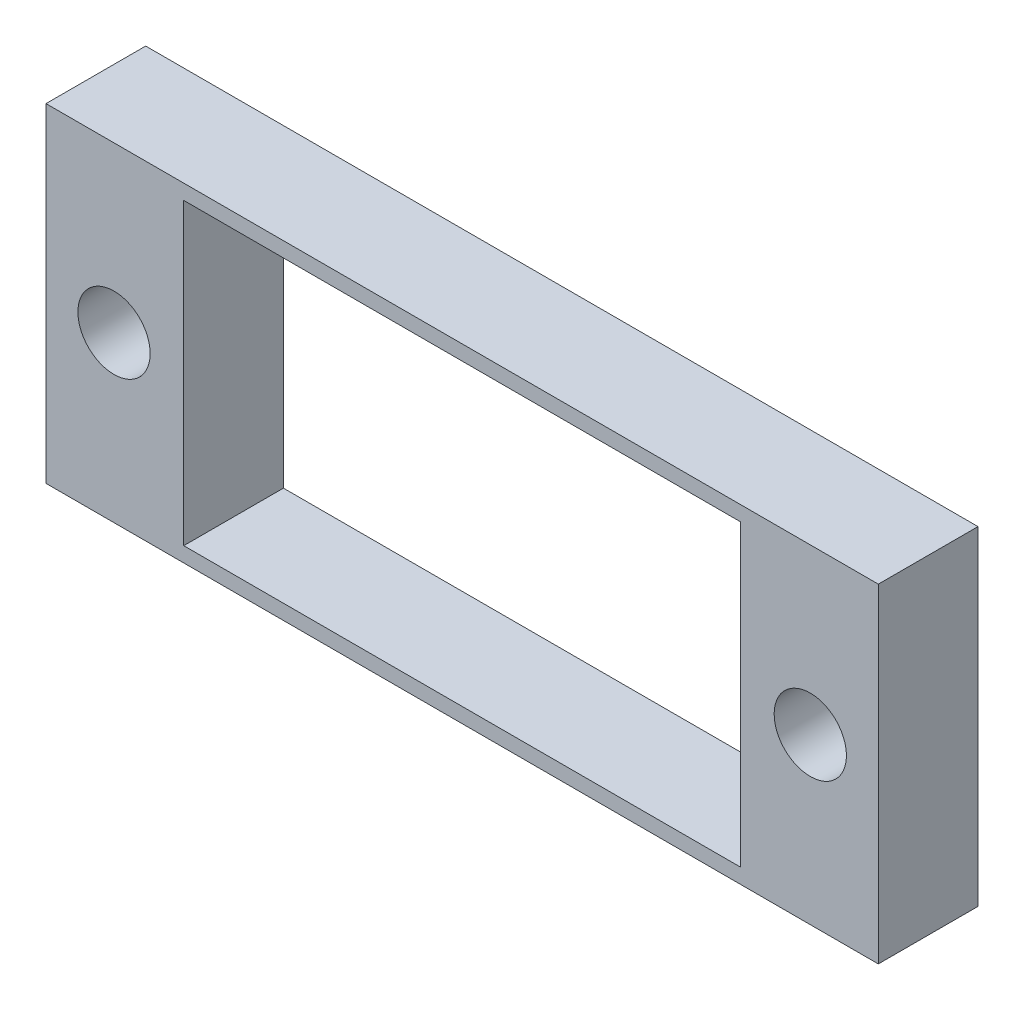
ISO-10303-21;
HEADER;
FILE_DESCRIPTION(('STEP AP214'),'2;1');
FILE_NAME('part.step','',(''),(''),'','','');
FILE_SCHEMA(('AUTOMOTIVE_DESIGN { 1 0 10303 214 1 1 1 1 }'));
ENDSEC;
DATA;
#1=APPLICATION_CONTEXT('core data for automotive mechanical design processes');
#2=APPLICATION_PROTOCOL_DEFINITION('international standard','automotive_design',2000,#1);
#3=PRODUCT_CONTEXT('',#1,'mechanical');
#4=PRODUCT('Part','Part','',(#3));
#5=PRODUCT_RELATED_PRODUCT_CATEGORY('part','',(#4));
#6=PRODUCT_DEFINITION_FORMATION('','',#4);
#7=PRODUCT_DEFINITION_CONTEXT('part definition',#1,'design');
#8=PRODUCT_DEFINITION('design','',#6,#7);
#9=PRODUCT_DEFINITION_SHAPE('','',#8);
#10=(LENGTH_UNIT() NAMED_UNIT(*) SI_UNIT(.MILLI.,.METRE.));
#11=(NAMED_UNIT(*) PLANE_ANGLE_UNIT() SI_UNIT($,.RADIAN.));
#12=(NAMED_UNIT(*) SI_UNIT($,.STERADIAN.) SOLID_ANGLE_UNIT());
#13=UNCERTAINTY_MEASURE_WITH_UNIT(LENGTH_MEASURE(1.E-05),#10,'distance_accuracy_value','');
#14=(GEOMETRIC_REPRESENTATION_CONTEXT(3) GLOBAL_UNCERTAINTY_ASSIGNED_CONTEXT((#13)) GLOBAL_UNIT_ASSIGNED_CONTEXT((#10,
#11,#12)) REPRESENTATION_CONTEXT('',''));
#15=CARTESIAN_POINT('',(0.,0.,0.));
#16=DIRECTION('',(0.,0.,1.));
#17=DIRECTION('',(1.,0.,0.));
#18=AXIS2_PLACEMENT_3D('',#15,#16,#17);
#19=CARTESIAN_POINT('',(0.,0.,4.));
#20=DIRECTION('',(0.,0.,-1.));
#21=DIRECTION('',(-1.,0.,0.));
#22=AXIS2_PLACEMENT_3D('',#19,#20,#21);
#23=PLANE('',#22);
#24=CARTESIAN_POINT('',(-13.97,0.,4.));
#25=DIRECTION('',(0.,0.,1.));
#26=DIRECTION('',(1.,0.,0.));
#27=AXIS2_PLACEMENT_3D('',#24,#25,#26);
#28=CIRCLE('',#27,1.45);
#29=CARTESIAN_POINT('',(-12.52,0.,4.));
#30=VERTEX_POINT('',#29);
#31=EDGE_CURVE('E223',#30,#30,#28,.T.);
#32=ORIENTED_EDGE('',*,*,#31,.F.);
#33=EDGE_LOOP('',(#32));
#34=FACE_BOUND('',#33,.T.);
#35=CARTESIAN_POINT('',(13.97,0.,4.));
#36=DIRECTION('',(0.,0.,1.));
#37=DIRECTION('',(-1.,0.,0.));
#38=AXIS2_PLACEMENT_3D('',#35,#36,#37);
#39=CIRCLE('',#38,1.45);
#40=CARTESIAN_POINT('',(12.52,0.,4.));
#41=VERTEX_POINT('',#40);
#42=EDGE_CURVE('E228',#41,#41,#39,.T.);
#43=ORIENTED_EDGE('',*,*,#42,.F.);
#44=EDGE_LOOP('',(#43));
#45=FACE_BOUND('',#44,.T.);
#46=DIRECTION('',(-1.,0.,0.));
#47=VECTOR('',#46,1.);
#48=CARTESIAN_POINT('',(-16.1,6.,4.));
#49=LINE('',#48,#47);
#50=CARTESIAN_POINT('',(11.1724,6.,4.));
#51=VERTEX_POINT('',#50);
#52=CARTESIAN_POINT('',(-11.1724,6.,4.));
#53=VERTEX_POINT('',#52);
#54=EDGE_CURVE('E106',#51,#53,#49,.T.);
#55=ORIENTED_EDGE('',*,*,#54,.F.);
#56=DIRECTION('',(0.,-1.,0.));
#57=VECTOR('',#56,1.);
#58=CARTESIAN_POINT('',(11.1724,6.,4.));
#59=LINE('',#58,#57);
#60=CARTESIAN_POINT('',(11.1724,-6.,4.));
#61=VERTEX_POINT('',#60);
#62=EDGE_CURVE('E102',#51,#61,#59,.T.);
#63=ORIENTED_EDGE('',*,*,#62,.T.);
#64=DIRECTION('',(1.,0.,0.));
#65=VECTOR('',#64,1.);
#66=CARTESIAN_POINT('',(-16.1,-6.,4.));
#67=LINE('',#66,#65);
#68=CARTESIAN_POINT('',(-11.1724,-6.,4.));
#69=VERTEX_POINT('',#68);
#70=EDGE_CURVE('E96',#69,#61,#67,.T.);
#71=ORIENTED_EDGE('',*,*,#70,.F.);
#72=DIRECTION('',(0.,1.,0.));
#73=VECTOR('',#72,1.);
#74=CARTESIAN_POINT('',(-11.1724,6.,4.));
#75=LINE('',#74,#73);
#76=EDGE_CURVE('E100',#69,#53,#75,.T.);
#77=ORIENTED_EDGE('',*,*,#76,.T.);
#78=EDGE_LOOP('',(#55,#63,#71,#77));
#79=FACE_BOUND('',#78,.T.);
#80=DIRECTION('',(0.,-1.,0.));
#81=VECTOR('',#80,1.);
#82=CARTESIAN_POINT('',(-16.7,-6.6,4.));
#83=LINE('',#82,#81);
#84=CARTESIAN_POINT('',(-16.7,6.6,4.));
#85=VERTEX_POINT('',#84);
#86=CARTESIAN_POINT('',(-16.7,-6.6,4.));
#87=VERTEX_POINT('',#86);
#88=EDGE_CURVE('E131',#85,#87,#83,.T.);
#89=ORIENTED_EDGE('',*,*,#88,.T.);
#90=DIRECTION('',(1.,0.,0.));
#91=VECTOR('',#90,1.);
#92=CARTESIAN_POINT('',(-16.7,-6.6,4.));
#93=LINE('',#92,#91);
#94=CARTESIAN_POINT('',(16.7,-6.6,4.));
#95=VERTEX_POINT('',#94);
#96=EDGE_CURVE('E134',#87,#95,#93,.T.);
#97=ORIENTED_EDGE('',*,*,#96,.T.);
#98=DIRECTION('',(0.,1.,0.));
#99=VECTOR('',#98,1.);
#100=CARTESIAN_POINT('',(16.7,-6.6,4.));
#101=LINE('',#100,#99);
#102=CARTESIAN_POINT('',(16.7,6.6,4.));
#103=VERTEX_POINT('',#102);
#104=EDGE_CURVE('E137',#95,#103,#101,.T.);
#105=ORIENTED_EDGE('',*,*,#104,.T.);
#106=DIRECTION('',(-1.,0.,0.));
#107=VECTOR('',#106,1.);
#108=CARTESIAN_POINT('',(-16.7,6.6,4.));
#109=LINE('',#108,#107);
#110=EDGE_CURVE('E139',#103,#85,#109,.T.);
#111=ORIENTED_EDGE('',*,*,#110,.T.);
#112=EDGE_LOOP('',(#89,#97,#105,#111));
#113=FACE_BOUND('',#112,.T.);
#114=ADVANCED_FACE('F33',(#34,#45,#79,#113),#23,.F.);
#115=CARTESIAN_POINT('',(0.,0.,0.));
#116=DIRECTION('',(0.,0.,-1.));
#117=DIRECTION('',(-1.,0.,0.));
#118=AXIS2_PLACEMENT_3D('',#115,#116,#117);
#119=PLANE('',#118);
#120=CARTESIAN_POINT('',(-13.97,0.,0.));
#121=DIRECTION('',(0.,0.,1.));
#122=DIRECTION('',(1.,0.,0.));
#123=AXIS2_PLACEMENT_3D('',#120,#121,#122);
#124=CIRCLE('',#123,1.45);
#125=CARTESIAN_POINT('',(-12.52,0.,0.));
#126=VERTEX_POINT('',#125);
#127=EDGE_CURVE('E221',#126,#126,#124,.T.);
#128=ORIENTED_EDGE('',*,*,#127,.T.);
#129=EDGE_LOOP('',(#128));
#130=FACE_BOUND('',#129,.T.);
#131=CARTESIAN_POINT('',(13.97,0.,0.));
#132=DIRECTION('',(0.,0.,1.));
#133=DIRECTION('',(-1.,0.,0.));
#134=AXIS2_PLACEMENT_3D('',#131,#132,#133);
#135=CIRCLE('',#134,1.45);
#136=CARTESIAN_POINT('',(12.52,0.,0.));
#137=VERTEX_POINT('',#136);
#138=EDGE_CURVE('E224',#137,#137,#135,.T.);
#139=ORIENTED_EDGE('',*,*,#138,.T.);
#140=EDGE_LOOP('',(#139));
#141=FACE_BOUND('',#140,.T.);
#142=DIRECTION('',(0.,-1.,0.));
#143=VECTOR('',#142,1.);
#144=CARTESIAN_POINT('',(11.1724,6.,0.));
#145=LINE('',#144,#143);
#146=CARTESIAN_POINT('',(11.1724,6.,0.));
#147=VERTEX_POINT('',#146);
#148=CARTESIAN_POINT('',(11.1724,-6.,0.));
#149=VERTEX_POINT('',#148);
#150=EDGE_CURVE('E233',#147,#149,#145,.T.);
#151=ORIENTED_EDGE('',*,*,#150,.F.);
#152=DIRECTION('',(-1.,0.,0.));
#153=VECTOR('',#152,1.);
#154=CARTESIAN_POINT('',(-16.1,6.,0.));
#155=LINE('',#154,#153);
#156=CARTESIAN_POINT('',(-11.1724,6.,0.));
#157=VERTEX_POINT('',#156);
#158=EDGE_CURVE('E53',#147,#157,#155,.T.);
#159=ORIENTED_EDGE('',*,*,#158,.T.);
#160=DIRECTION('',(0.,1.,0.));
#161=VECTOR('',#160,1.);
#162=CARTESIAN_POINT('',(-11.1724,6.,0.));
#163=LINE('',#162,#161);
#164=CARTESIAN_POINT('',(-11.1724,-6.,0.));
#165=VERTEX_POINT('',#164);
#166=EDGE_CURVE('E117',#165,#157,#163,.T.);
#167=ORIENTED_EDGE('',*,*,#166,.F.);
#168=DIRECTION('',(1.,0.,0.));
#169=VECTOR('',#168,1.);
#170=CARTESIAN_POINT('',(-16.1,-6.,0.));
#171=LINE('',#170,#169);
#172=EDGE_CURVE('E112',#165,#149,#171,.T.);
#173=ORIENTED_EDGE('',*,*,#172,.T.);
#174=EDGE_LOOP('',(#151,#159,#167,#173));
#175=FACE_BOUND('',#174,.T.);
#176=DIRECTION('',(0.,-1.,0.));
#177=VECTOR('',#176,1.);
#178=CARTESIAN_POINT('',(-16.7,-6.6,0.));
#179=LINE('',#178,#177);
#180=CARTESIAN_POINT('',(-16.7,6.6,0.));
#181=VERTEX_POINT('',#180);
#182=CARTESIAN_POINT('',(-16.7,-6.6,0.));
#183=VERTEX_POINT('',#182);
#184=EDGE_CURVE('E105',#181,#183,#179,.T.);
#185=ORIENTED_EDGE('',*,*,#184,.F.);
#186=DIRECTION('',(-1.,0.,0.));
#187=VECTOR('',#186,1.);
#188=CARTESIAN_POINT('',(-16.7,6.6,0.));
#189=LINE('',#188,#187);
#190=CARTESIAN_POINT('',(16.7,6.6,0.));
#191=VERTEX_POINT('',#190);
#192=EDGE_CURVE('E135',#191,#181,#189,.T.);
#193=ORIENTED_EDGE('',*,*,#192,.F.);
#194=DIRECTION('',(0.,1.,0.));
#195=VECTOR('',#194,1.);
#196=CARTESIAN_POINT('',(16.7,-6.6,0.));
#197=LINE('',#196,#195);
#198=CARTESIAN_POINT('',(16.7,-6.6,0.));
#199=VERTEX_POINT('',#198);
#200=EDGE_CURVE('E146',#199,#191,#197,.T.);
#201=ORIENTED_EDGE('',*,*,#200,.F.);
#202=DIRECTION('',(1.,0.,0.));
#203=VECTOR('',#202,1.);
#204=CARTESIAN_POINT('',(-16.7,-6.6,0.));
#205=LINE('',#204,#203);
#206=EDGE_CURVE('E144',#183,#199,#205,.T.);
#207=ORIENTED_EDGE('',*,*,#206,.F.);
#208=EDGE_LOOP('',(#185,#193,#201,#207));
#209=FACE_BOUND('',#208,.T.);
#210=ADVANCED_FACE('F164',(#130,#141,#175,#209),#119,.T.);
#211=CARTESIAN_POINT('',(-16.7,-6.6,4.));
#212=DIRECTION('',(1.,0.,0.));
#213=DIRECTION('',(0.,0.,-1.));
#214=AXIS2_PLACEMENT_3D('',#211,#212,#213);
#215=PLANE('',#214);
#216=ORIENTED_EDGE('',*,*,#184,.T.);
#217=DIRECTION('',(0.,0.,-1.));
#218=VECTOR('',#217,1.);
#219=CARTESIAN_POINT('',(-16.7,-6.6,4.));
#220=LINE('',#219,#218);
#221=EDGE_CURVE('E11',#87,#183,#220,.T.);
#222=ORIENTED_EDGE('',*,*,#221,.F.);
#223=ORIENTED_EDGE('',*,*,#88,.F.);
#224=DIRECTION('',(0.,0.,-1.));
#225=VECTOR('',#224,1.);
#226=CARTESIAN_POINT('',(-16.7,6.6,4.));
#227=LINE('',#226,#225);
#228=EDGE_CURVE('E141',#85,#181,#227,.T.);
#229=ORIENTED_EDGE('',*,*,#228,.T.);
#230=EDGE_LOOP('',(#216,#222,#223,#229));
#231=FACE_BOUND('',#230,.T.);
#232=ADVANCED_FACE('F35',(#231),#215,.F.);
#233=CARTESIAN_POINT('',(-16.7,-6.6,4.));
#234=DIRECTION('',(0.,1.,0.));
#235=DIRECTION('',(0.,0.,1.));
#236=AXIS2_PLACEMENT_3D('',#233,#234,#235);
#237=PLANE('',#236);
#238=ORIENTED_EDGE('',*,*,#206,.T.);
#239=DIRECTION('',(0.,0.,-1.));
#240=VECTOR('',#239,1.);
#241=CARTESIAN_POINT('',(16.7,-6.6,4.));
#242=LINE('',#241,#240);
#243=EDGE_CURVE('E41',#95,#199,#242,.T.);
#244=ORIENTED_EDGE('',*,*,#243,.F.);
#245=ORIENTED_EDGE('',*,*,#96,.F.);
#246=ORIENTED_EDGE('',*,*,#221,.T.);
#247=EDGE_LOOP('',(#238,#244,#245,#246));
#248=FACE_BOUND('',#247,.T.);
#249=ADVANCED_FACE('F172',(#248),#237,.F.);
#250=CARTESIAN_POINT('',(16.7,-6.6,4.));
#251=DIRECTION('',(-1.,0.,0.));
#252=DIRECTION('',(0.,0.,1.));
#253=AXIS2_PLACEMENT_3D('',#250,#251,#252);
#254=PLANE('',#253);
#255=ORIENTED_EDGE('',*,*,#200,.T.);
#256=DIRECTION('',(0.,0.,-1.));
#257=VECTOR('',#256,1.);
#258=CARTESIAN_POINT('',(16.7,6.6,4.));
#259=LINE('',#258,#257);
#260=EDGE_CURVE('E151',#103,#191,#259,.T.);
#261=ORIENTED_EDGE('',*,*,#260,.F.);
#262=ORIENTED_EDGE('',*,*,#104,.F.);
#263=ORIENTED_EDGE('',*,*,#243,.T.);
#264=EDGE_LOOP('',(#255,#261,#262,#263));
#265=FACE_BOUND('',#264,.T.);
#266=ADVANCED_FACE('F158',(#265),#254,.F.);
#267=CARTESIAN_POINT('',(-16.7,6.6,4.));
#268=DIRECTION('',(0.,-1.,0.));
#269=DIRECTION('',(0.,0.,-1.));
#270=AXIS2_PLACEMENT_3D('',#267,#268,#269);
#271=PLANE('',#270);
#272=ORIENTED_EDGE('',*,*,#192,.T.);
#273=ORIENTED_EDGE('',*,*,#228,.F.);
#274=ORIENTED_EDGE('',*,*,#110,.F.);
#275=ORIENTED_EDGE('',*,*,#260,.T.);
#276=EDGE_LOOP('',(#272,#273,#274,#275));
#277=FACE_BOUND('',#276,.T.);
#278=ADVANCED_FACE('F167',(#277),#271,.F.);
#279=CARTESIAN_POINT('',(-16.1,6.,4.));
#280=DIRECTION('',(0.,-1.,0.));
#281=DIRECTION('',(0.,0.,-1.));
#282=AXIS2_PLACEMENT_3D('',#279,#280,#281);
#283=PLANE('',#282);
#284=DIRECTION('',(0.,0.,1.));
#285=VECTOR('',#284,1.);
#286=CARTESIAN_POINT('',(11.1724,6.,0.));
#287=LINE('',#286,#285);
#288=EDGE_CURVE('E48',#147,#51,#287,.T.);
#289=ORIENTED_EDGE('',*,*,#288,.T.);
#290=ORIENTED_EDGE('',*,*,#54,.T.);
#291=DIRECTION('',(0.,0.,1.));
#292=VECTOR('',#291,1.);
#293=CARTESIAN_POINT('',(-11.1724,6.,0.));
#294=LINE('',#293,#292);
#295=EDGE_CURVE('E116',#157,#53,#294,.T.);
#296=ORIENTED_EDGE('',*,*,#295,.F.);
#297=ORIENTED_EDGE('',*,*,#158,.F.);
#298=EDGE_LOOP('',(#289,#290,#296,#297));
#299=FACE_BOUND('',#298,.T.);
#300=ADVANCED_FACE('F190',(#299),#283,.T.);
#301=CARTESIAN_POINT('',(-16.1,-6.,4.));
#302=DIRECTION('',(0.,1.,0.));
#303=DIRECTION('',(0.,0.,1.));
#304=AXIS2_PLACEMENT_3D('',#301,#302,#303);
#305=PLANE('',#304);
#306=DIRECTION('',(0.,0.,1.));
#307=VECTOR('',#306,1.);
#308=CARTESIAN_POINT('',(11.1724,-6.,0.));
#309=LINE('',#308,#307);
#310=EDGE_CURVE('E121',#149,#61,#309,.T.);
#311=ORIENTED_EDGE('',*,*,#310,.F.);
#312=ORIENTED_EDGE('',*,*,#172,.F.);
#313=DIRECTION('',(0.,0.,1.));
#314=VECTOR('',#313,1.);
#315=CARTESIAN_POINT('',(-11.1724,-6.,0.));
#316=LINE('',#315,#314);
#317=EDGE_CURVE('E109',#165,#69,#316,.T.);
#318=ORIENTED_EDGE('',*,*,#317,.T.);
#319=ORIENTED_EDGE('',*,*,#70,.T.);
#320=EDGE_LOOP('',(#311,#312,#318,#319));
#321=FACE_BOUND('',#320,.T.);
#322=ADVANCED_FACE('F110',(#321),#305,.T.);
#323=CARTESIAN_POINT('',(-11.1724,6.,0.));
#324=DIRECTION('',(1.,0.,0.));
#325=DIRECTION('',(0.,1.,0.));
#326=AXIS2_PLACEMENT_3D('',#323,#324,#325);
#327=PLANE('',#326);
#328=ORIENTED_EDGE('',*,*,#76,.F.);
#329=ORIENTED_EDGE('',*,*,#317,.F.);
#330=ORIENTED_EDGE('',*,*,#166,.T.);
#331=ORIENTED_EDGE('',*,*,#295,.T.);
#332=EDGE_LOOP('',(#328,#329,#330,#331));
#333=FACE_BOUND('',#332,.T.);
#334=ADVANCED_FACE('F120',(#333),#327,.T.);
#335=CARTESIAN_POINT('',(11.1724,6.,0.));
#336=DIRECTION('',(-1.,0.,0.));
#337=DIRECTION('',(0.,-1.,0.));
#338=AXIS2_PLACEMENT_3D('',#335,#336,#337);
#339=PLANE('',#338);
#340=ORIENTED_EDGE('',*,*,#62,.F.);
#341=ORIENTED_EDGE('',*,*,#288,.F.);
#342=ORIENTED_EDGE('',*,*,#150,.T.);
#343=ORIENTED_EDGE('',*,*,#310,.T.);
#344=EDGE_LOOP('',(#340,#341,#342,#343));
#345=FACE_BOUND('',#344,.T.);
#346=ADVANCED_FACE('F203',(#345),#339,.T.);
#347=CARTESIAN_POINT('',(13.97,0.,0.));
#348=DIRECTION('',(0.,0.,1.));
#349=DIRECTION('',(1.,0.,0.));
#350=AXIS2_PLACEMENT_3D('',#347,#348,#349);
#351=CYLINDRICAL_SURFACE('',#350,1.45);
#352=ORIENTED_EDGE('',*,*,#138,.F.);
#353=EDGE_LOOP('',(#352));
#354=FACE_BOUND('',#353,.T.);
#355=ORIENTED_EDGE('',*,*,#42,.T.);
#356=EDGE_LOOP('',(#355));
#357=FACE_BOUND('',#356,.T.);
#358=ADVANCED_FACE('F208',(#354,#357),#351,.F.);
#359=CARTESIAN_POINT('',(-13.97,0.,0.));
#360=DIRECTION('',(0.,0.,1.));
#361=DIRECTION('',(1.,0.,0.));
#362=AXIS2_PLACEMENT_3D('',#359,#360,#361);
#363=CYLINDRICAL_SURFACE('',#362,1.45);
#364=ORIENTED_EDGE('',*,*,#127,.F.);
#365=EDGE_LOOP('',(#364));
#366=FACE_BOUND('',#365,.T.);
#367=ORIENTED_EDGE('',*,*,#31,.T.);
#368=EDGE_LOOP('',(#367));
#369=FACE_BOUND('',#368,.T.);
#370=ADVANCED_FACE('F212',(#366,#369),#363,.F.);
#371=CLOSED_SHELL('',(#114,#210,#232,#249,#266,#278,#300,#322,#334,#346,#358,#370));
#372=MANIFOLD_SOLID_BREP('B2',#371);
#373=ADVANCED_BREP_SHAPE_REPRESENTATION('',(#18,#372),#14);
#374=SHAPE_DEFINITION_REPRESENTATION(#9,#373);
ENDSEC;
END-ISO-10303-21;
